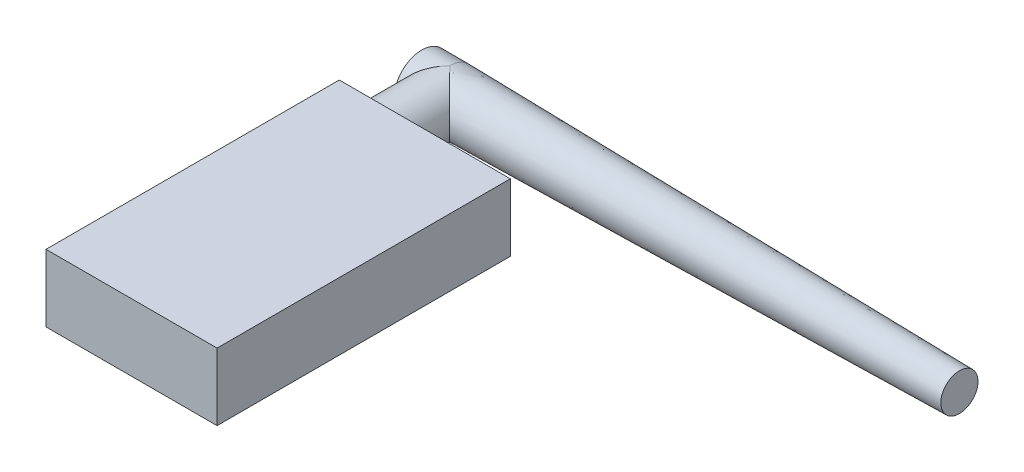
ISO-10303-21;
HEADER;
FILE_DESCRIPTION(('STEP AP214'),'2;1');
FILE_NAME('part.step','',(''),(''),'','','');
FILE_SCHEMA(('AUTOMOTIVE_DESIGN { 1 0 10303 214 1 1 1 1 }'));
ENDSEC;
DATA;
#1=APPLICATION_CONTEXT('core data for automotive mechanical design processes');
#2=APPLICATION_PROTOCOL_DEFINITION('international standard','automotive_design',2000,#1);
#3=PRODUCT_CONTEXT('',#1,'mechanical');
#4=PRODUCT('Part','Part','',(#3));
#5=PRODUCT_RELATED_PRODUCT_CATEGORY('part','',(#4));
#6=PRODUCT_DEFINITION_FORMATION('','',#4);
#7=PRODUCT_DEFINITION_CONTEXT('part definition',#1,'design');
#8=PRODUCT_DEFINITION('design','',#6,#7);
#9=PRODUCT_DEFINITION_SHAPE('','',#8);
#10=(LENGTH_UNIT() NAMED_UNIT(*) SI_UNIT(.MILLI.,.METRE.));
#11=(NAMED_UNIT(*) PLANE_ANGLE_UNIT() SI_UNIT($,.RADIAN.));
#12=(NAMED_UNIT(*) SI_UNIT($,.STERADIAN.) SOLID_ANGLE_UNIT());
#13=UNCERTAINTY_MEASURE_WITH_UNIT(LENGTH_MEASURE(1.E-05),#10,'distance_accuracy_value','');
#14=(GEOMETRIC_REPRESENTATION_CONTEXT(3) GLOBAL_UNCERTAINTY_ASSIGNED_CONTEXT((#13)) GLOBAL_UNIT_ASSIGNED_CONTEXT((#10,
#11,#12)) REPRESENTATION_CONTEXT('',''));
#15=CARTESIAN_POINT('',(0.,0.,0.));
#16=DIRECTION('',(0.,0.,1.));
#17=DIRECTION('',(1.,0.,0.));
#18=AXIS2_PLACEMENT_3D('',#15,#16,#17);
#19=CARTESIAN_POINT('',(-8.,5.5,-36.));
#20=DIRECTION('',(0.,0.,1.));
#21=DIRECTION('',(1.,0.,0.));
#22=AXIS2_PLACEMENT_3D('',#19,#20,#21);
#23=CYLINDRICAL_SURFACE('',#22,4.50000000000001);
#24=CARTESIAN_POINT('',(-8.,5.5,-24.));
#25=DIRECTION('',(0.,0.,1.));
#26=DIRECTION('',(1.,0.,0.));
#27=AXIS2_PLACEMENT_3D('',#24,#25,#26);
#28=CIRCLE('',#27,4.50000000000001);
#29=CARTESIAN_POINT('',(-3.49999999999999,5.5,-24.));
#30=VERTEX_POINT('',#29);
#31=EDGE_CURVE('E99',#30,#30,#28,.F.);
#32=ORIENTED_EDGE('',*,*,#31,.T.);
#33=EDGE_LOOP('',(#32));
#34=FACE_BOUND('',#33,.T.);
#35=CARTESIAN_POINT('',(-8.,10.,-36.));
#36=DIRECTION('',(0.999847695156391,-0.0174524064372935,0.));
#37=VECTOR('',#36,1.);
#38=LINE('',#35,#37);
#39=CARTESIAN_POINT('',(-8.00000000000036,10.,-36.));
#40=VERTEX_POINT('',#39);
#41=CARTESIAN_POINT('',(-7.84295226483838,9.99725872158592,-36.));
#42=VERTEX_POINT('',#41);
#43=EDGE_CURVE('E44',#40,#42,#38,.T.);
#44=ORIENTED_EDGE('',*,*,#43,.F.);
#45=CARTESIAN_POINT('',(-8.,5.5,-36.));
#46=DIRECTION('',(0.707106781186547,0.,0.707106781186547));
#47=DIRECTION('',(-0.707106781186547,0.,0.707106781186547));
#48=AXIS2_PLACEMENT_3D('',#45,#46,#47);
#49=ELLIPSE('',#48,6.36396103067893,4.5);
#50=CARTESIAN_POINT('',(-12.5,5.5,-31.5));
#51=VERTEX_POINT('',#50);
#52=EDGE_CURVE('E51',#40,#51,#49,.T.);
#53=ORIENTED_EDGE('',*,*,#52,.T.);
#54=CARTESIAN_POINT('',(-8.00000000000057,0.999999999999991,-36.));
#55=VERTEX_POINT('',#54);
#56=EDGE_CURVE('E55',#51,#55,#49,.T.);
#57=ORIENTED_EDGE('',*,*,#56,.T.);
#58=CARTESIAN_POINT('',(-7.84295226483817,1.00274127841408,-36.));
#59=DIRECTION('',(-0.999847695156391,-0.0174524064372858,0.));
#60=VECTOR('',#59,1.);
#61=LINE('',#58,#60);
#62=CARTESIAN_POINT('',(-7.84295226483817,1.00274127841408,-36.));
#63=VERTEX_POINT('',#62);
#64=EDGE_CURVE('E11',#63,#55,#61,.T.);
#65=ORIENTED_EDGE('',*,*,#64,.F.);
#66=CARTESIAN_POINT('',(-7.84295201021671,9.99725871269433,-36.0002));
#67=CARTESIAN_POINT('',(-7.8430081214043,9.99726031545217,-35.9941365790483));
#68=CARTESIAN_POINT('',(-7.84228221425581,9.99723536481108,-35.988152055177));
#69=CARTESIAN_POINT('',(-7.83971187325033,9.99714466919175,-35.9765769082634));
#70=CARTESIAN_POINT('',(-7.83789661411246,9.99707998725572,-35.9709801184979));
#71=CARTESIAN_POINT('',(-7.83075620367853,9.99681871100791,-35.9530864836502));
#72=CARTESIAN_POINT('',(-7.82392209187022,9.9965595281993,-35.9414471582572));
#73=CARTESIAN_POINT('',(-7.80884515061898,9.99594514848129,-35.9188410974285));
#74=CARTESIAN_POINT('',(-7.8005715733187,9.99558772867071,-35.9078982183017));
#75=CARTESIAN_POINT('',(-7.75360352110605,9.99341007124409,-35.8483822805991));
#76=CARTESIAN_POINT('',(-7.71060996364233,9.99087949807724,-35.8033193145021));
#77=CARTESIAN_POINT('',(-7.62500965237488,9.98456457110039,-35.7141888632322));
#78=CARTESIAN_POINT('',(-7.58240413748502,9.98079497317709,-35.6701158896918));
#79=CARTESIAN_POINT('',(-7.45374078219427,9.96754226860819,-35.5381929772838));
#80=CARTESIAN_POINT('',(-7.36715016298264,9.95612908682449,-35.4509726415188));
#81=CARTESIAN_POINT('',(-7.19431804867035,9.92816190085538,-35.2770092320254));
#82=CARTESIAN_POINT('',(-7.10807670356956,9.91160588522284,-35.1902663585734));
#83=CARTESIAN_POINT('',(-6.93551039898256,9.87317917406284,-35.0169619081816));
#84=CARTESIAN_POINT('',(-6.84918803846753,9.85127720815955,-34.9304045365849));
#85=CARTESIAN_POINT('',(-6.67727651648432,9.80213959892798,-34.758085405652));
#86=CARTESIAN_POINT('',(-6.59168738721181,9.77490372263157,-34.6723236812385));
#87=CARTESIAN_POINT('',(-6.35837457149531,9.69281985373739,-34.4386079257339));
#88=CARTESIAN_POINT('',(-6.21156885855398,9.63245895636451,-34.2916237352373));
#89=CARTESIAN_POINT('',(-5.92190426520467,9.49465430385843,-34.001658520232));
#90=CARTESIAN_POINT('',(-5.77904732575742,9.41720231015234,-33.8586794639402));
#91=CARTESIAN_POINT('',(-5.49909438479812,9.24465480579073,-33.5785173804232));
#92=CARTESIAN_POINT('',(-5.36198568048365,9.14960102074347,-33.441321568921));
#93=CARTESIAN_POINT('',(-5.09509802674766,8.94096164952637,-33.1742799850222));
#94=CARTESIAN_POINT('',(-4.96531353018974,8.82739034857751,-33.0444286499657));
#95=CARTESIAN_POINT('',(-4.69073744205126,8.5566124089989,-32.7697214490772));
#96=CARTESIAN_POINT('',(-4.54797384119564,8.39521581752912,-32.6268966310543));
#97=CARTESIAN_POINT('',(-4.28140437528532,8.04373476804786,-32.3602197497383));
#98=CARTESIAN_POINT('',(-4.1575706855799,7.85369324735158,-32.2363398396365));
#99=CARTESIAN_POINT('',(-3.95617227452287,7.48322458746467,-32.0348693818312));
#100=CARTESIAN_POINT('',(-3.87428574726704,7.30756556790083,-31.9529548349348));
#101=CARTESIAN_POINT('',(-3.76755294933374,7.03171415706334,-31.8461863727301));
#102=CARTESIAN_POINT('',(-3.73465018157948,6.93767092811397,-31.8132727752889));
#103=CARTESIAN_POINT('',(-3.67475144948302,6.74591243696929,-31.7533545285005));
#104=CARTESIAN_POINT('',(-3.64775275632513,6.64819889573723,-31.7263471493466));
#105=CARTESIAN_POINT('',(-3.59995820301951,6.44880787206666,-31.6785373340708));
#106=CARTESIAN_POINT('',(-3.57921933334413,6.34710296834143,-31.6577919077687));
#107=CARTESIAN_POINT('',(-3.54472415994478,6.14139321763243,-31.6232858817869));
#108=CARTESIAN_POINT('',(-3.53096433712799,6.03738955743122,-31.6095217618749));
#109=CARTESIAN_POINT('',(-3.51073830905016,5.82800546088948,-31.5892894315431));
#110=CARTESIAN_POINT('',(-3.50426947244317,5.72262553514755,-31.5828185889504));
#111=CARTESIAN_POINT('',(-3.4987759338092,5.51148563182981,-31.5773233461775));
#112=CARTESIAN_POINT('',(-3.4997503185228,5.40572570247078,-31.5782980324549));
#113=CARTESIAN_POINT('',(-3.50848980167079,5.20897814122578,-31.5870402284884));
#114=CARTESIAN_POINT('',(-3.51532945262273,5.11790619804071,-31.5938820032623));
#115=CARTESIAN_POINT('',(-3.53444086145081,4.93690145200235,-31.6129993729934));
#116=CARTESIAN_POINT('',(-3.54671427612298,4.84696900519963,-31.6252766252693));
#117=CARTESIAN_POINT('',(-3.59138957205704,4.57986974797276,-31.6699659730289));
#118=CARTESIAN_POINT('',(-3.63165468310959,4.40522899307135,-31.7102438397206));
#119=CARTESIAN_POINT('',(-3.73150211284014,4.06397026411114,-31.8101236068309));
#120=CARTESIAN_POINT('',(-3.79141430220999,3.89754945984652,-31.8700554949705));
#121=CARTESIAN_POINT('',(-3.92721843501076,3.57839658440815,-32.0059056999091));
#122=CARTESIAN_POINT('',(-4.00311712737647,3.42567033353601,-32.0818307684628));
#123=CARTESIAN_POINT('',(-4.21037325905971,3.06016681502549,-32.2891619024443));
#124=CARTESIAN_POINT('',(-4.35016630243481,2.85695047819425,-32.4290080360062));
#125=CARTESIAN_POINT('',(-4.65109437531685,2.48463551029306,-32.7300611839001));
#126=CARTESIAN_POINT('',(-4.8122886617655,2.31563502333271,-32.8913275082012));
#127=CARTESIAN_POINT('',(-5.09761869370058,2.05747602796914,-33.1768028511544));
#128=CARTESIAN_POINT('',(-5.21796055623739,1.95972584673418,-33.2972108339474));
#129=CARTESIAN_POINT('',(-5.46424013383753,1.77935062341854,-33.543641955195));
#130=CARTESIAN_POINT('',(-5.59018045694161,1.6967327244403,-33.6696677107643));
#131=CARTESIAN_POINT('',(-5.84616578860298,1.54613736637012,-33.9258548605098));
#132=CARTESIAN_POINT('',(-5.97620655183291,1.47814530061415,-34.0560119782151));
#133=CARTESIAN_POINT('',(-6.23943248242984,1.35615741815988,-34.3195241231131));
#134=CARTESIAN_POINT('',(-6.37261624906401,1.30215549040917,-34.4528777261393));
#135=CARTESIAN_POINT('',(-6.60216677492924,1.22141950653832,-34.6828186465745));
#136=CARTESIAN_POINT('',(-6.69796777062584,1.19132357798235,-34.7788110534292));
#137=CARTESIAN_POINT('',(-6.89043123284261,1.13779523067893,-34.9717695571));
#138=CARTESIAN_POINT('',(-6.98709358104692,1.11436191087131,-35.0687355204128));
#139=CARTESIAN_POINT('',(-7.14336536275616,1.08187243663992,-35.2257238523919));
#140=CARTESIAN_POINT('',(-7.20281075666645,1.07076454896418,-35.2854941611879));
#141=CARTESIAN_POINT('',(-7.32165430433317,1.05101509639151,-35.4052057774595));
#142=CARTESIAN_POINT('',(-7.381052240208,1.0423677906531,-35.465146351822));
#143=CARTESIAN_POINT('',(-7.4740135429862,1.03071776158922,-35.5593752758));
#144=CARTESIAN_POINT('',(-7.50761578620003,1.02689300414345,-35.5935215270548));
#145=CARTESIAN_POINT('',(-7.57486669249107,1.01999794151445,-35.66228839911));
#146=CARTESIAN_POINT('',(-7.60851408123004,1.01693301414277,-35.696910667313));
#147=CARTESIAN_POINT('',(-7.67581969683286,1.01156646762827,-35.7669187774576));
#148=CARTESIAN_POINT('',(-7.70947503760563,1.00927231403167,-35.8023087404431));
#149=CARTESIAN_POINT('',(-7.7580889802449,1.00647695385121,-35.8565349862553));
#150=CARTESIAN_POINT('',(-7.77388564850613,1.00565609159102,-35.8746794259851));
#151=CARTESIAN_POINT('',(-7.80420127031575,1.00423879951577,-35.9120068841564));
#152=CARTESIAN_POINT('',(-7.81873244546302,1.00363998291421,-35.9311761616852));
#153=CARTESIAN_POINT('',(-7.832333203467,1.00312363540438,-35.9576036284829));
#154=CARTESIAN_POINT('',(-7.83480491340889,1.00303267008573,-35.96295869211));
#155=CARTESIAN_POINT('',(-7.83890359775,1.00288405973125,-35.9739488155523));
#156=CARTESIAN_POINT('',(-7.84053823511074,1.00282611186476,-35.9795807984022));
#157=CARTESIAN_POINT('',(-7.842040284026,1.00277319204361,-35.9877595787339));
#158=CARTESIAN_POINT('',(-7.84238346942131,1.00276116564532,-35.9902204389427));
#159=CARTESIAN_POINT('',(-7.84284472893713,1.002745034256,-35.9951867814209));
#160=CARTESIAN_POINT('',(-7.84296061167945,1.00274100637246,-35.997692465284));
#161=CARTESIAN_POINT('',(-7.84295201021653,1.00274128730567,-36.0002));
#162=B_SPLINE_CURVE_WITH_KNOTS('',3,(#66,#67,#68,#69,#70,#71,#72,#73,#74,#75,#76,#77,#78,#79,
#80,#81,#82,#83,#84,#85,#86,#87,#88,#89,#90,#91,#92,#93,#94,#95,#96,#97,#98,#99,#100,#101,#102,
#103,#104,#105,#106,#107,#108,#109,#110,#111,#112,#113,#114,#115,#116,#117,#118,#119,#120,#121,
#122,#123,#124,#125,#126,#127,#128,#129,#130,#131,#132,#133,#134,#135,#136,#137,#138,#139,#140,
#141,#142,#143,#144,#145,#146,#147,#148,#149,#150,#151,#152,#153,#154,#155,#156,#157,#158,#159,
#160,#161),.UNSPECIFIED.,.F.,.F.,(4,2,2,2,2,2,2,2,2,2,2,2,2,2,2,2,2,2,2,2,2,2,2,2,2,2,2,2,2,2,2,
2,2,2,2,2,2,2,2,2,2,2,2,2,2,2,2,4),(0.,0.0180190559208642,0.03557581519588,0.0757512077024117,
0.116923510033805,0.303420015223962,0.487771420976681,0.857850106284114,1.2280737181036,
1.60051710222197,1.97297675710425,2.62122346871628,3.26978334571362,3.91682502773244,
4.56336989492572,5.33634108850226,6.10816495206993,6.73666080322056,7.05111132227889,
7.36541619621634,7.68250176474967,7.99942728769626,8.31623839429735,8.63301062981366,
8.90742541923778,9.18192393751252,9.73041026999976,10.2886223092898,10.847070479942,
11.6930067912277,12.5413362258922,13.1295239962365,13.7179887054952,14.3058629644165,
14.8934799985039,15.31008057854,15.7266247901243,15.9816746749139,16.2361245241001,
16.3802880587792,16.5254445348189,16.6719689527302,16.7442995538608,16.8158284340651,
16.8334833221978,16.850973562324,16.858418041756,16.8659339458424),.UNSPECIFIED.);
#163=EDGE_CURVE('E87',#42,#63,#162,.T.);
#164=ORIENTED_EDGE('',*,*,#163,.F.);
#165=EDGE_LOOP('',(#44,#53,#57,#65,#164));
#166=FACE_BOUND('',#165,.T.);
#167=ADVANCED_FACE('F33',(#34,#166),#23,.T.);
#168=CARTESIAN_POINT('',(14.,11.,24.));
#169=DIRECTION('',(-1.,0.,0.));
#170=DIRECTION('',(0.,0.,1.));
#171=AXIS2_PLACEMENT_3D('',#168,#169,#170);
#172=PLANE('',#171);
#173=DIRECTION('',(0.,0.,-1.));
#174=VECTOR('',#173,1.);
#175=CARTESIAN_POINT('',(14.,0.,24.));
#176=LINE('',#175,#174);
#177=CARTESIAN_POINT('',(14.,0.,24.));
#178=VERTEX_POINT('',#177);
#179=CARTESIAN_POINT('',(14.,0.,-24.));
#180=VERTEX_POINT('',#179);
#181=EDGE_CURVE('E151',#178,#180,#176,.T.);
#182=ORIENTED_EDGE('',*,*,#181,.T.);
#183=DIRECTION('',(0.,-1.,0.));
#184=VECTOR('',#183,1.);
#185=CARTESIAN_POINT('',(14.,11.,-24.));
#186=LINE('',#185,#184);
#187=CARTESIAN_POINT('',(14.,11.,-24.));
#188=VERTEX_POINT('',#187);
#189=EDGE_CURVE('E167',#188,#180,#186,.T.);
#190=ORIENTED_EDGE('',*,*,#189,.F.);
#191=DIRECTION('',(0.,0.,-1.));
#192=VECTOR('',#191,1.);
#193=CARTESIAN_POINT('',(14.,11.,24.));
#194=LINE('',#193,#192);
#195=CARTESIAN_POINT('',(14.,11.,24.));
#196=VERTEX_POINT('',#195);
#197=EDGE_CURVE('E140',#196,#188,#194,.T.);
#198=ORIENTED_EDGE('',*,*,#197,.F.);
#199=DIRECTION('',(0.,-1.,0.));
#200=VECTOR('',#199,1.);
#201=CARTESIAN_POINT('',(14.,11.,24.));
#202=LINE('',#201,#200);
#203=EDGE_CURVE('E150',#196,#178,#202,.T.);
#204=ORIENTED_EDGE('',*,*,#203,.T.);
#205=EDGE_LOOP('',(#182,#190,#198,#204));
#206=FACE_BOUND('',#205,.T.);
#207=ADVANCED_FACE('F35',(#206),#172,.F.);
#208=CARTESIAN_POINT('',(-14.,11.,-24.));
#209=DIRECTION('',(0.,0.,1.));
#210=DIRECTION('',(1.,0.,0.));
#211=AXIS2_PLACEMENT_3D('',#208,#209,#210);
#212=PLANE('',#211);
#213=ORIENTED_EDGE('',*,*,#31,.F.);
#214=EDGE_LOOP('',(#213));
#215=FACE_BOUND('',#214,.T.);
#216=DIRECTION('',(-1.,0.,0.));
#217=VECTOR('',#216,1.);
#218=CARTESIAN_POINT('',(-14.,0.,-24.));
#219=LINE('',#218,#217);
#220=CARTESIAN_POINT('',(-14.,0.,-24.));
#221=VERTEX_POINT('',#220);
#222=EDGE_CURVE('E154',#180,#221,#219,.T.);
#223=ORIENTED_EDGE('',*,*,#222,.T.);
#224=DIRECTION('',(0.,-1.,0.));
#225=VECTOR('',#224,1.);
#226=CARTESIAN_POINT('',(-14.,11.,-24.));
#227=LINE('',#226,#225);
#228=CARTESIAN_POINT('',(-14.,11.,-24.));
#229=VERTEX_POINT('',#228);
#230=EDGE_CURVE('E164',#229,#221,#227,.T.);
#231=ORIENTED_EDGE('',*,*,#230,.F.);
#232=DIRECTION('',(-1.,0.,0.));
#233=VECTOR('',#232,1.);
#234=CARTESIAN_POINT('',(-14.,11.,-24.));
#235=LINE('',#234,#233);
#236=EDGE_CURVE('E143',#188,#229,#235,.T.);
#237=ORIENTED_EDGE('',*,*,#236,.F.);
#238=ORIENTED_EDGE('',*,*,#189,.T.);
#239=EDGE_LOOP('',(#223,#231,#237,#238));
#240=FACE_BOUND('',#239,.T.);
#241=ADVANCED_FACE('F200',(#215,#240),#212,.F.);
#242=CARTESIAN_POINT('',(-14.,11.,24.));
#243=DIRECTION('',(1.,0.,0.));
#244=DIRECTION('',(0.,0.,-1.));
#245=AXIS2_PLACEMENT_3D('',#242,#243,#244);
#246=PLANE('',#245);
#247=DIRECTION('',(0.,0.,1.));
#248=VECTOR('',#247,1.);
#249=CARTESIAN_POINT('',(-14.,0.,24.));
#250=LINE('',#249,#248);
#251=CARTESIAN_POINT('',(-14.,0.,24.));
#252=VERTEX_POINT('',#251);
#253=EDGE_CURVE('E156',#221,#252,#250,.T.);
#254=ORIENTED_EDGE('',*,*,#253,.T.);
#255=DIRECTION('',(0.,-1.,0.));
#256=VECTOR('',#255,1.);
#257=CARTESIAN_POINT('',(-14.,11.,24.));
#258=LINE('',#257,#256);
#259=CARTESIAN_POINT('',(-14.,11.,24.));
#260=VERTEX_POINT('',#259);
#261=EDGE_CURVE('E161',#260,#252,#258,.T.);
#262=ORIENTED_EDGE('',*,*,#261,.F.);
#263=DIRECTION('',(0.,0.,1.));
#264=VECTOR('',#263,1.);
#265=CARTESIAN_POINT('',(-14.,11.,24.));
#266=LINE('',#265,#264);
#267=EDGE_CURVE('E146',#229,#260,#266,.T.);
#268=ORIENTED_EDGE('',*,*,#267,.F.);
#269=ORIENTED_EDGE('',*,*,#230,.T.);
#270=EDGE_LOOP('',(#254,#262,#268,#269));
#271=FACE_BOUND('',#270,.T.);
#272=ADVANCED_FACE('F197',(#271),#246,.F.);
#273=CARTESIAN_POINT('',(-14.,11.,24.));
#274=DIRECTION('',(0.,0.,-1.));
#275=DIRECTION('',(-1.,0.,0.));
#276=AXIS2_PLACEMENT_3D('',#273,#274,#275);
#277=PLANE('',#276);
#278=DIRECTION('',(1.,0.,0.));
#279=VECTOR('',#278,1.);
#280=CARTESIAN_POINT('',(-14.,0.,24.));
#281=LINE('',#280,#279);
#282=EDGE_CURVE('E144',#252,#178,#281,.T.);
#283=ORIENTED_EDGE('',*,*,#282,.T.);
#284=ORIENTED_EDGE('',*,*,#203,.F.);
#285=DIRECTION('',(1.,0.,0.));
#286=VECTOR('',#285,1.);
#287=CARTESIAN_POINT('',(-14.,11.,24.));
#288=LINE('',#287,#286);
#289=EDGE_CURVE('E148',#260,#196,#288,.T.);
#290=ORIENTED_EDGE('',*,*,#289,.F.);
#291=ORIENTED_EDGE('',*,*,#261,.T.);
#292=EDGE_LOOP('',(#283,#284,#290,#291));
#293=FACE_BOUND('',#292,.T.);
#294=ADVANCED_FACE('F190',(#293),#277,.F.);
#295=CARTESIAN_POINT('',(0.,11.,0.));
#296=DIRECTION('',(0.,-1.,0.));
#297=DIRECTION('',(0.,0.,-1.));
#298=AXIS2_PLACEMENT_3D('',#295,#296,#297);
#299=PLANE('',#298);
#300=ORIENTED_EDGE('',*,*,#197,.T.);
#301=ORIENTED_EDGE('',*,*,#236,.T.);
#302=ORIENTED_EDGE('',*,*,#267,.T.);
#303=ORIENTED_EDGE('',*,*,#289,.T.);
#304=EDGE_LOOP('',(#300,#301,#302,#303));
#305=FACE_BOUND('',#304,.T.);
#306=ADVANCED_FACE('F184',(#305),#299,.F.);
#307=CARTESIAN_POINT('',(0.,0.,0.));
#308=DIRECTION('',(0.,-1.,0.));
#309=DIRECTION('',(0.,0.,-1.));
#310=AXIS2_PLACEMENT_3D('',#307,#308,#309);
#311=PLANE('',#310);
#312=ORIENTED_EDGE('',*,*,#181,.F.);
#313=ORIENTED_EDGE('',*,*,#282,.F.);
#314=ORIENTED_EDGE('',*,*,#253,.F.);
#315=ORIENTED_EDGE('',*,*,#222,.F.);
#316=EDGE_LOOP('',(#312,#313,#314,#315));
#317=FACE_BOUND('',#316,.T.);
#318=ADVANCED_FACE('F189',(#317),#311,.T.);
#319=CARTESIAN_POINT('',(-12.5,5.5,-36.));
#320=DIRECTION('',(1.,0.,0.));
#321=DIRECTION('',(0.,0.,-1.));
#322=AXIS2_PLACEMENT_3D('',#319,#320,#321);
#323=CYLINDRICAL_SURFACE('',#322,4.5);
#324=ORIENTED_EDGE('',*,*,#52,.F.);
#325=CARTESIAN_POINT('',(-8.,5.5,-36.));
#326=DIRECTION('',(1.,0.,0.));
#327=DIRECTION('',(0.,0.,-1.));
#328=AXIS2_PLACEMENT_3D('',#325,#326,#327);
#329=CIRCLE('',#328,4.5);
#330=EDGE_CURVE('E98',#55,#40,#329,.T.);
#331=ORIENTED_EDGE('',*,*,#330,.F.);
#332=ORIENTED_EDGE('',*,*,#56,.F.);
#333=CARTESIAN_POINT('',(-12.5,5.5,-36.));
#334=DIRECTION('',(1.,0.,0.));
#335=DIRECTION('',(0.,0.,-1.));
#336=AXIS2_PLACEMENT_3D('',#333,#334,#335);
#337=CIRCLE('',#336,4.5);
#338=EDGE_CURVE('E91',#51,#51,#337,.T.);
#339=ORIENTED_EDGE('',*,*,#338,.T.);
#340=EDGE_LOOP('',(#324,#331,#332,#339));
#341=FACE_BOUND('',#340,.T.);
#342=ADVANCED_FACE('F183',(#341),#323,.T.);
#343=CARTESIAN_POINT('',(-12.5,5.5,-36.));
#344=DIRECTION('',(1.,0.,0.));
#345=DIRECTION('',(0.,0.,-1.));
#346=AXIS2_PLACEMENT_3D('',#343,#344,#345);
#347=PLANE('',#346);
#348=ORIENTED_EDGE('',*,*,#338,.F.);
#349=EDGE_LOOP('',(#348));
#350=FACE_BOUND('',#349,.T.);
#351=ADVANCED_FACE('F118',(#350),#347,.F.);
#352=CARTESIAN_POINT('',(-8.,5.5,-36.));
#353=DIRECTION('',(-1.,0.,0.));
#354=DIRECTION('',(0.,0.,-1.));
#355=AXIS2_PLACEMENT_3D('',#352,#353,#354);
#356=CONICAL_SURFACE('',#355,4.5,0.0174532925199433);
#357=ORIENTED_EDGE('',*,*,#64,.T.);
#358=ORIENTED_EDGE('',*,*,#330,.T.);
#359=ORIENTED_EDGE('',*,*,#43,.T.);
#360=ORIENTED_EDGE('',*,*,#163,.T.);
#361=EDGE_LOOP('',(#357,#358,#359,#360));
#362=FACE_BOUND('',#361,.T.);
#363=CARTESIAN_POINT('',(75.5,5.5,-36.));
#364=DIRECTION('',(1.,0.,0.));
#365=DIRECTION('',(0.,0.,-1.));
#366=AXIS2_PLACEMENT_3D('',#363,#364,#365);
#367=CIRCLE('',#366,3.04250207849383);
#368=CARTESIAN_POINT('',(75.5,5.5,-39.0425020784938));
#369=VERTEX_POINT('',#368);
#370=EDGE_CURVE('E290',#369,#369,#367,.T.);
#371=ORIENTED_EDGE('',*,*,#370,.F.);
#372=EDGE_LOOP('',(#371));
#373=FACE_BOUND('',#372,.T.);
#374=ADVANCED_FACE('F95',(#362,#373),#356,.T.);
#375=CARTESIAN_POINT('',(75.5,5.5,-36.));
#376=DIRECTION('',(1.,0.,0.));
#377=DIRECTION('',(0.,0.,-1.));
#378=AXIS2_PLACEMENT_3D('',#375,#376,#377);
#379=PLANE('',#378);
#380=ORIENTED_EDGE('',*,*,#370,.T.);
#381=EDGE_LOOP('',(#380));
#382=FACE_BOUND('',#381,.T.);
#383=ADVANCED_FACE('F117',(#382),#379,.T.);
#384=CLOSED_SHELL('',(#167,#207,#241,#272,#294,#306,#318,#342,#351,#374,#383));
#385=MANIFOLD_SOLID_BREP('B2',#384);
#386=ADVANCED_BREP_SHAPE_REPRESENTATION('',(#18,#385),#14);
#387=SHAPE_DEFINITION_REPRESENTATION(#9,#386);
ENDSEC;
END-ISO-10303-21;
